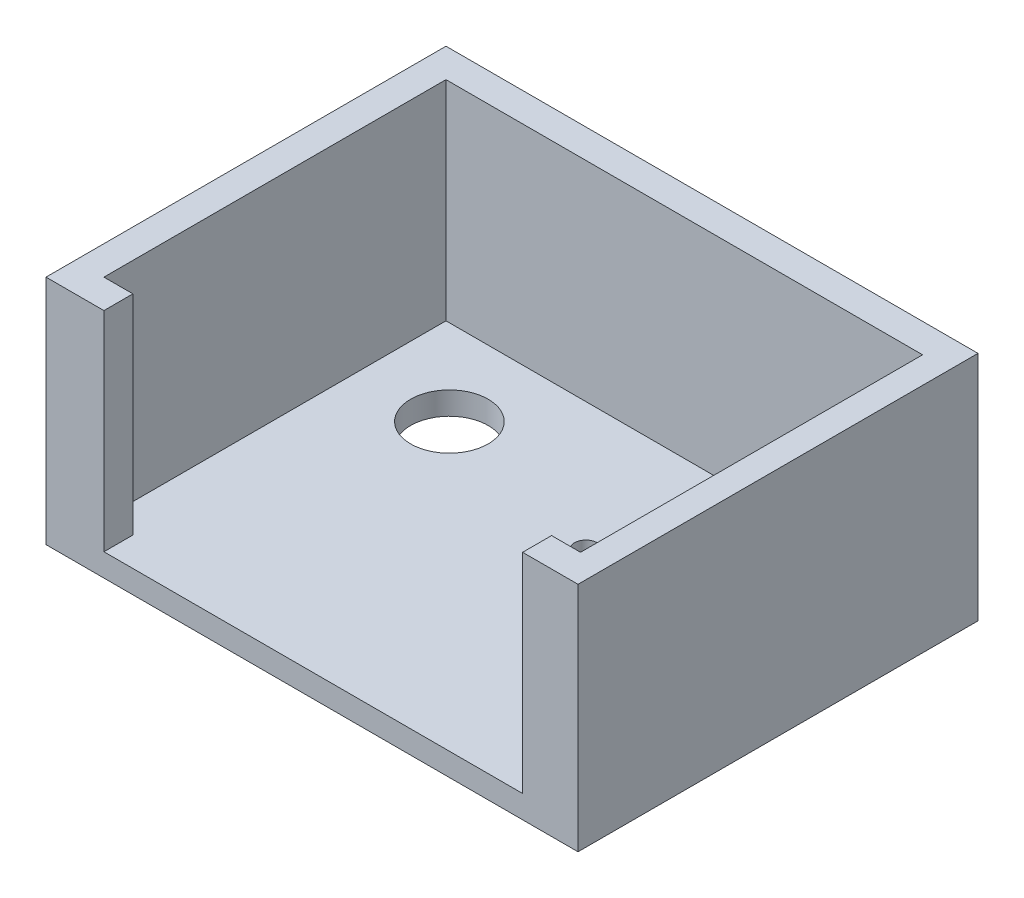
ISO-10303-21;
HEADER;
FILE_DESCRIPTION(('STEP AP214'),'2;1');
FILE_NAME('part.step','',(''),(''),'','','');
FILE_SCHEMA(('AUTOMOTIVE_DESIGN { 1 0 10303 214 1 1 1 1 }'));
ENDSEC;
DATA;
#1=APPLICATION_CONTEXT('core data for automotive mechanical design processes');
#2=APPLICATION_PROTOCOL_DEFINITION('international standard','automotive_design',2000,#1);
#3=PRODUCT_CONTEXT('',#1,'mechanical');
#4=PRODUCT('Part','Part','',(#3));
#5=PRODUCT_RELATED_PRODUCT_CATEGORY('part','',(#4));
#6=PRODUCT_DEFINITION_FORMATION('','',#4);
#7=PRODUCT_DEFINITION_CONTEXT('part definition',#1,'design');
#8=PRODUCT_DEFINITION('design','',#6,#7);
#9=PRODUCT_DEFINITION_SHAPE('','',#8);
#10=(LENGTH_UNIT() NAMED_UNIT(*) SI_UNIT(.MILLI.,.METRE.));
#11=(NAMED_UNIT(*) PLANE_ANGLE_UNIT() SI_UNIT($,.RADIAN.));
#12=(NAMED_UNIT(*) SI_UNIT($,.STERADIAN.) SOLID_ANGLE_UNIT());
#13=UNCERTAINTY_MEASURE_WITH_UNIT(LENGTH_MEASURE(1.E-05),#10,'distance_accuracy_value','');
#14=(GEOMETRIC_REPRESENTATION_CONTEXT(3) GLOBAL_UNCERTAINTY_ASSIGNED_CONTEXT((#13)) GLOBAL_UNIT_ASSIGNED_CONTEXT((#10,
#11,#12)) REPRESENTATION_CONTEXT('',''));
#15=CARTESIAN_POINT('',(0.,0.,0.));
#16=DIRECTION('',(0.,0.,1.));
#17=DIRECTION('',(1.,0.,0.));
#18=AXIS2_PLACEMENT_3D('',#15,#16,#17);
#19=CARTESIAN_POINT('',(1.27,1.,-1.27));
#20=DIRECTION('',(0.,0.,1.));
#21=DIRECTION('',(1.,0.,0.));
#22=AXIS2_PLACEMENT_3D('',#19,#20,#21);
#23=PLANE('',#22);
#24=DIRECTION('',(1.,0.,0.));
#25=VECTOR('',#24,1.);
#26=CARTESIAN_POINT('',(1.27,1.,-1.27));
#27=LINE('',#26,#25);
#28=CARTESIAN_POINT('',(20.9,1.,-1.27));
#29=VERTEX_POINT('',#28);
#30=CARTESIAN_POINT('',(22.17,1.,-1.27));
#31=VERTEX_POINT('',#30);
#32=EDGE_CURVE('E183',#29,#31,#27,.T.);
#33=ORIENTED_EDGE('',*,*,#32,.F.);
#34=DIRECTION('',(0.,-1.,0.));
#35=VECTOR('',#34,1.);
#36=CARTESIAN_POINT('',(20.9,1.,-1.27));
#37=LINE('',#36,#35);
#38=CARTESIAN_POINT('',(20.9,10.16,-1.27));
#39=VERTEX_POINT('',#38);
#40=EDGE_CURVE('E133',#39,#29,#37,.T.);
#41=ORIENTED_EDGE('',*,*,#40,.F.);
#42=DIRECTION('',(1.,0.,0.));
#43=VECTOR('',#42,1.);
#44=CARTESIAN_POINT('',(1.27,10.16,-1.27));
#45=LINE('',#44,#43);
#46=CARTESIAN_POINT('',(22.17,10.16,-1.27));
#47=VERTEX_POINT('',#46);
#48=EDGE_CURVE('E195',#39,#47,#45,.T.);
#49=ORIENTED_EDGE('',*,*,#48,.T.);
#50=DIRECTION('',(0.,1.,0.));
#51=VECTOR('',#50,1.);
#52=CARTESIAN_POINT('',(22.17,1.,-1.27));
#53=LINE('',#52,#51);
#54=EDGE_CURVE('E209',#31,#47,#53,.T.);
#55=ORIENTED_EDGE('',*,*,#54,.F.);
#56=EDGE_LOOP('',(#33,#41,#49,#55));
#57=FACE_BOUND('',#56,.T.);
#58=ADVANCED_FACE('F41',(#57),#23,.F.);
#59=CARTESIAN_POINT('',(0.,10.16,0.));
#60=DIRECTION('',(1.,0.,0.));
#61=DIRECTION('',(0.,0.,-1.));
#62=AXIS2_PLACEMENT_3D('',#59,#60,#61);
#63=PLANE('',#62);
#64=DIRECTION('',(0.,0.,1.));
#65=VECTOR('',#64,1.);
#66=CARTESIAN_POINT('',(0.,0.,0.));
#67=LINE('',#66,#65);
#68=CARTESIAN_POINT('',(0.,0.,-17.54));
#69=VERTEX_POINT('',#68);
#70=CARTESIAN_POINT('',(0.,0.,0.));
#71=VERTEX_POINT('',#70);
#72=EDGE_CURVE('E206',#69,#71,#67,.T.);
#73=ORIENTED_EDGE('',*,*,#72,.T.);
#74=DIRECTION('',(0.,-1.,0.));
#75=VECTOR('',#74,1.);
#76=CARTESIAN_POINT('',(0.,10.16,0.));
#77=LINE('',#76,#75);
#78=CARTESIAN_POINT('',(0.,10.16,0.));
#79=VERTEX_POINT('',#78);
#80=EDGE_CURVE('E11',#79,#71,#77,.T.);
#81=ORIENTED_EDGE('',*,*,#80,.F.);
#82=DIRECTION('',(0.,0.,1.));
#83=VECTOR('',#82,1.);
#84=CARTESIAN_POINT('',(0.,10.16,0.));
#85=LINE('',#84,#83);
#86=CARTESIAN_POINT('',(0.,10.16,-17.54));
#87=VERTEX_POINT('',#86);
#88=EDGE_CURVE('E213',#87,#79,#85,.T.);
#89=ORIENTED_EDGE('',*,*,#88,.F.);
#90=DIRECTION('',(0.,-1.,0.));
#91=VECTOR('',#90,1.);
#92=CARTESIAN_POINT('',(0.,10.16,-17.54));
#93=LINE('',#92,#91);
#94=EDGE_CURVE('E224',#87,#69,#93,.T.);
#95=ORIENTED_EDGE('',*,*,#94,.T.);
#96=EDGE_LOOP('',(#73,#81,#89,#95));
#97=FACE_BOUND('',#96,.T.);
#98=ADVANCED_FACE('F43',(#97),#63,.F.);
#99=CARTESIAN_POINT('',(0.,10.16,0.));
#100=DIRECTION('',(0.,0.,-1.));
#101=DIRECTION('',(-1.,0.,0.));
#102=AXIS2_PLACEMENT_3D('',#99,#100,#101);
#103=PLANE('',#102);
#104=DIRECTION('',(1.,0.,0.));
#105=VECTOR('',#104,1.);
#106=CARTESIAN_POINT('',(0.,10.16,0.));
#107=LINE('',#106,#105);
#108=CARTESIAN_POINT('',(20.9,10.16,0.));
#109=VERTEX_POINT('',#108);
#110=CARTESIAN_POINT('',(23.33,10.16,0.));
#111=VERTEX_POINT('',#110);
#112=EDGE_CURVE('E150',#109,#111,#107,.T.);
#113=ORIENTED_EDGE('',*,*,#112,.F.);
#114=DIRECTION('',(0.,-1.,0.));
#115=VECTOR('',#114,1.);
#116=CARTESIAN_POINT('',(20.9,1.,0.));
#117=LINE('',#116,#115);
#118=CARTESIAN_POINT('',(20.9,1.,0.));
#119=VERTEX_POINT('',#118);
#120=EDGE_CURVE('E130',#109,#119,#117,.T.);
#121=ORIENTED_EDGE('',*,*,#120,.T.);
#122=DIRECTION('',(-1.,0.,0.));
#123=VECTOR('',#122,1.);
#124=CARTESIAN_POINT('',(20.9,1.,0.));
#125=LINE('',#124,#123);
#126=CARTESIAN_POINT('',(2.54,1.,0.));
#127=VERTEX_POINT('',#126);
#128=EDGE_CURVE('E139',#119,#127,#125,.T.);
#129=ORIENTED_EDGE('',*,*,#128,.T.);
#130=DIRECTION('',(0.,1.,0.));
#131=VECTOR('',#130,1.);
#132=CARTESIAN_POINT('',(2.54,1.,0.));
#133=LINE('',#132,#131);
#134=CARTESIAN_POINT('',(2.54,10.16,0.));
#135=VERTEX_POINT('',#134);
#136=EDGE_CURVE('E136',#127,#135,#133,.T.);
#137=ORIENTED_EDGE('',*,*,#136,.T.);
#138=EDGE_CURVE('E217',#79,#135,#107,.T.);
#139=ORIENTED_EDGE('',*,*,#138,.F.);
#140=ORIENTED_EDGE('',*,*,#80,.T.);
#141=DIRECTION('',(1.,0.,0.));
#142=VECTOR('',#141,1.);
#143=CARTESIAN_POINT('',(0.,0.,0.));
#144=LINE('',#143,#142);
#145=CARTESIAN_POINT('',(23.33,0.,0.));
#146=VERTEX_POINT('',#145);
#147=EDGE_CURVE('E227',#71,#146,#144,.T.);
#148=ORIENTED_EDGE('',*,*,#147,.T.);
#149=DIRECTION('',(0.,-1.,0.));
#150=VECTOR('',#149,1.);
#151=CARTESIAN_POINT('',(23.33,10.16,0.));
#152=LINE('',#151,#150);
#153=EDGE_CURVE('E49',#111,#146,#152,.T.);
#154=ORIENTED_EDGE('',*,*,#153,.F.);
#155=EDGE_LOOP('',(#113,#121,#129,#137,#139,#140,#148,#154));
#156=FACE_BOUND('',#155,.T.);
#157=ADVANCED_FACE('F148',(#156),#103,.F.);
#158=CARTESIAN_POINT('',(23.33,10.16,0.));
#159=DIRECTION('',(-1.,0.,0.));
#160=DIRECTION('',(0.,0.,1.));
#161=AXIS2_PLACEMENT_3D('',#158,#159,#160);
#162=PLANE('',#161);
#163=DIRECTION('',(0.,0.,-1.));
#164=VECTOR('',#163,1.);
#165=CARTESIAN_POINT('',(23.33,0.,0.));
#166=LINE('',#165,#164);
#167=CARTESIAN_POINT('',(23.33,0.,-17.54));
#168=VERTEX_POINT('',#167);
#169=EDGE_CURVE('E229',#146,#168,#166,.T.);
#170=ORIENTED_EDGE('',*,*,#169,.T.);
#171=DIRECTION('',(0.,-1.,0.));
#172=VECTOR('',#171,1.);
#173=CARTESIAN_POINT('',(23.33,10.16,-17.54));
#174=LINE('',#173,#172);
#175=CARTESIAN_POINT('',(23.33,10.16,-17.54));
#176=VERTEX_POINT('',#175);
#177=EDGE_CURVE('E234',#176,#168,#174,.T.);
#178=ORIENTED_EDGE('',*,*,#177,.F.);
#179=DIRECTION('',(0.,0.,-1.));
#180=VECTOR('',#179,1.);
#181=CARTESIAN_POINT('',(23.33,10.16,0.));
#182=LINE('',#181,#180);
#183=EDGE_CURVE('E220',#111,#176,#182,.T.);
#184=ORIENTED_EDGE('',*,*,#183,.F.);
#185=ORIENTED_EDGE('',*,*,#153,.T.);
#186=EDGE_LOOP('',(#170,#178,#184,#185));
#187=FACE_BOUND('',#186,.T.);
#188=ADVANCED_FACE('F240',(#187),#162,.F.);
#189=CARTESIAN_POINT('',(0.,10.16,-17.54));
#190=DIRECTION('',(0.,0.,1.));
#191=DIRECTION('',(1.,0.,0.));
#192=AXIS2_PLACEMENT_3D('',#189,#190,#191);
#193=PLANE('',#192);
#194=DIRECTION('',(-1.,0.,0.));
#195=VECTOR('',#194,1.);
#196=CARTESIAN_POINT('',(0.,0.,-17.54));
#197=LINE('',#196,#195);
#198=EDGE_CURVE('E216',#168,#69,#197,.T.);
#199=ORIENTED_EDGE('',*,*,#198,.T.);
#200=ORIENTED_EDGE('',*,*,#94,.F.);
#201=DIRECTION('',(-1.,0.,0.));
#202=VECTOR('',#201,1.);
#203=CARTESIAN_POINT('',(0.,10.16,-17.54));
#204=LINE('',#203,#202);
#205=EDGE_CURVE('E222',#176,#87,#204,.T.);
#206=ORIENTED_EDGE('',*,*,#205,.F.);
#207=ORIENTED_EDGE('',*,*,#177,.T.);
#208=EDGE_LOOP('',(#199,#200,#206,#207));
#209=FACE_BOUND('',#208,.T.);
#210=ADVANCED_FACE('F248',(#209),#193,.F.);
#211=CARTESIAN_POINT('',(0.,10.16,0.));
#212=DIRECTION('',(0.,-1.,0.));
#213=DIRECTION('',(0.,0.,-1.));
#214=AXIS2_PLACEMENT_3D('',#211,#212,#213);
#215=PLANE('',#214);
#216=ORIENTED_EDGE('',*,*,#48,.F.);
#217=DIRECTION('',(0.,0.,1.));
#218=VECTOR('',#217,1.);
#219=CARTESIAN_POINT('',(20.9,10.16,0.));
#220=LINE('',#219,#218);
#221=EDGE_CURVE('E161',#39,#109,#220,.T.);
#222=ORIENTED_EDGE('',*,*,#221,.T.);
#223=ORIENTED_EDGE('',*,*,#112,.T.);
#224=ORIENTED_EDGE('',*,*,#183,.T.);
#225=ORIENTED_EDGE('',*,*,#205,.T.);
#226=ORIENTED_EDGE('',*,*,#88,.T.);
#227=ORIENTED_EDGE('',*,*,#138,.T.);
#228=DIRECTION('',(0.,0.,-1.));
#229=VECTOR('',#228,1.);
#230=CARTESIAN_POINT('',(2.54,10.16,0.));
#231=LINE('',#230,#229);
#232=CARTESIAN_POINT('',(2.54,10.16,-1.27));
#233=VERTEX_POINT('',#232);
#234=EDGE_CURVE('E157',#135,#233,#231,.T.);
#235=ORIENTED_EDGE('',*,*,#234,.T.);
#236=CARTESIAN_POINT('',(1.27,10.16,-1.27));
#237=VERTEX_POINT('',#236);
#238=EDGE_CURVE('E196',#237,#233,#45,.T.);
#239=ORIENTED_EDGE('',*,*,#238,.F.);
#240=DIRECTION('',(0.,0.,1.));
#241=VECTOR('',#240,1.);
#242=CARTESIAN_POINT('',(1.27,10.16,-1.27));
#243=LINE('',#242,#241);
#244=CARTESIAN_POINT('',(1.27,10.16,-16.27));
#245=VERTEX_POINT('',#244);
#246=EDGE_CURVE('E64',#245,#237,#243,.T.);
#247=ORIENTED_EDGE('',*,*,#246,.F.);
#248=DIRECTION('',(-1.,0.,0.));
#249=VECTOR('',#248,1.);
#250=CARTESIAN_POINT('',(1.27,10.16,-16.27));
#251=LINE('',#250,#249);
#252=CARTESIAN_POINT('',(22.17,10.16,-16.27));
#253=VERTEX_POINT('',#252);
#254=EDGE_CURVE('E184',#253,#245,#251,.T.);
#255=ORIENTED_EDGE('',*,*,#254,.F.);
#256=DIRECTION('',(0.,0.,-1.));
#257=VECTOR('',#256,1.);
#258=CARTESIAN_POINT('',(22.17,10.16,-1.27));
#259=LINE('',#258,#257);
#260=EDGE_CURVE('E199',#47,#253,#259,.T.);
#261=ORIENTED_EDGE('',*,*,#260,.F.);
#262=EDGE_LOOP('',(#216,#222,#223,#224,#225,#226,#227,#235,#239,#247,#255,#261));
#263=FACE_BOUND('',#262,.T.);
#264=ADVANCED_FACE('F255',(#263),#215,.F.);
#265=CARTESIAN_POINT('',(0.,0.,0.));
#266=DIRECTION('',(0.,-1.,0.));
#267=DIRECTION('',(0.,0.,-1.));
#268=AXIS2_PLACEMENT_3D('',#265,#266,#267);
#269=PLANE('',#268);
#270=CARTESIAN_POINT('',(5.17,0.,-12.52));
#271=DIRECTION('',(0.,1.,0.));
#272=DIRECTION('',(0.,0.,1.));
#273=AXIS2_PLACEMENT_3D('',#270,#271,#272);
#274=CIRCLE('',#273,1.7);
#275=CARTESIAN_POINT('',(5.17,0.,-10.82));
#276=VERTEX_POINT('',#275);
#277=EDGE_CURVE('E164',#276,#276,#274,.T.);
#278=ORIENTED_EDGE('',*,*,#277,.T.);
#279=EDGE_LOOP('',(#278));
#280=FACE_BOUND('',#279,.T.);
#281=CARTESIAN_POINT('',(18.27,0.,-12.52));
#282=DIRECTION('',(0.,1.,0.));
#283=DIRECTION('',(0.,0.,1.));
#284=AXIS2_PLACEMENT_3D('',#281,#282,#283);
#285=CIRCLE('',#284,1.7);
#286=CARTESIAN_POINT('',(18.27,0.,-10.82));
#287=VERTEX_POINT('',#286);
#288=EDGE_CURVE('E173',#287,#287,#285,.T.);
#289=ORIENTED_EDGE('',*,*,#288,.T.);
#290=EDGE_LOOP('',(#289));
#291=FACE_BOUND('',#290,.T.);
#292=CARTESIAN_POINT('',(13.015,0.,-10.66));
#293=DIRECTION('',(0.,1.,0.));
#294=DIRECTION('',(0.,0.,1.));
#295=AXIS2_PLACEMENT_3D('',#292,#293,#294);
#296=CIRCLE('',#295,0.500000000000001);
#297=CARTESIAN_POINT('',(13.015,0.,-10.16));
#298=VERTEX_POINT('',#297);
#299=EDGE_CURVE('E163',#298,#298,#296,.T.);
#300=ORIENTED_EDGE('',*,*,#299,.T.);
#301=EDGE_LOOP('',(#300));
#302=FACE_BOUND('',#301,.T.);
#303=ORIENTED_EDGE('',*,*,#72,.F.);
#304=ORIENTED_EDGE('',*,*,#198,.F.);
#305=ORIENTED_EDGE('',*,*,#169,.F.);
#306=ORIENTED_EDGE('',*,*,#147,.F.);
#307=EDGE_LOOP('',(#303,#304,#305,#306));
#308=FACE_BOUND('',#307,.T.);
#309=ADVANCED_FACE('F245',(#280,#291,#302,#308),#269,.T.);
#310=CARTESIAN_POINT('',(1.27,1.,-1.27));
#311=DIRECTION('',(-1.,0.,0.));
#312=DIRECTION('',(0.,0.,1.));
#313=AXIS2_PLACEMENT_3D('',#310,#311,#312);
#314=PLANE('',#313);
#315=ORIENTED_EDGE('',*,*,#246,.T.);
#316=DIRECTION('',(0.,1.,0.));
#317=VECTOR('',#316,1.);
#318=CARTESIAN_POINT('',(1.27,1.,-1.27));
#319=LINE('',#318,#317);
#320=CARTESIAN_POINT('',(1.27,1.,-1.27));
#321=VERTEX_POINT('',#320);
#322=EDGE_CURVE('E193',#321,#237,#319,.T.);
#323=ORIENTED_EDGE('',*,*,#322,.F.);
#324=DIRECTION('',(0.,0.,1.));
#325=VECTOR('',#324,1.);
#326=CARTESIAN_POINT('',(1.27,1.,-1.27));
#327=LINE('',#326,#325);
#328=CARTESIAN_POINT('',(1.27,1.,-16.27));
#329=VERTEX_POINT('',#328);
#330=EDGE_CURVE('E181',#329,#321,#327,.T.);
#331=ORIENTED_EDGE('',*,*,#330,.F.);
#332=DIRECTION('',(0.,1.,0.));
#333=VECTOR('',#332,1.);
#334=CARTESIAN_POINT('',(1.27,1.,-16.27));
#335=LINE('',#334,#333);
#336=EDGE_CURVE('E204',#329,#245,#335,.T.);
#337=ORIENTED_EDGE('',*,*,#336,.T.);
#338=EDGE_LOOP('',(#315,#323,#331,#337));
#339=FACE_BOUND('',#338,.T.);
#340=ADVANCED_FACE('F266',(#339),#314,.F.);
#341=CARTESIAN_POINT('',(1.27,1.,-16.27));
#342=DIRECTION('',(0.,0.,-1.));
#343=DIRECTION('',(-1.,0.,0.));
#344=AXIS2_PLACEMENT_3D('',#341,#342,#343);
#345=PLANE('',#344);
#346=ORIENTED_EDGE('',*,*,#254,.T.);
#347=ORIENTED_EDGE('',*,*,#336,.F.);
#348=DIRECTION('',(-1.,0.,0.));
#349=VECTOR('',#348,1.);
#350=CARTESIAN_POINT('',(1.27,1.,-16.27));
#351=LINE('',#350,#349);
#352=CARTESIAN_POINT('',(22.17,1.,-16.27));
#353=VERTEX_POINT('',#352);
#354=EDGE_CURVE('E190',#353,#329,#351,.T.);
#355=ORIENTED_EDGE('',*,*,#354,.F.);
#356=DIRECTION('',(0.,1.,0.));
#357=VECTOR('',#356,1.);
#358=CARTESIAN_POINT('',(22.17,1.,-16.27));
#359=LINE('',#358,#357);
#360=EDGE_CURVE('E207',#353,#253,#359,.T.);
#361=ORIENTED_EDGE('',*,*,#360,.T.);
#362=EDGE_LOOP('',(#346,#347,#355,#361));
#363=FACE_BOUND('',#362,.T.);
#364=ADVANCED_FACE('F263',(#363),#345,.F.);
#365=CARTESIAN_POINT('',(22.17,1.,-1.27));
#366=DIRECTION('',(1.,0.,0.));
#367=DIRECTION('',(0.,0.,-1.));
#368=AXIS2_PLACEMENT_3D('',#365,#366,#367);
#369=PLANE('',#368);
#370=ORIENTED_EDGE('',*,*,#260,.T.);
#371=ORIENTED_EDGE('',*,*,#360,.F.);
#372=DIRECTION('',(0.,0.,-1.));
#373=VECTOR('',#372,1.);
#374=CARTESIAN_POINT('',(22.17,1.,-1.27));
#375=LINE('',#374,#373);
#376=EDGE_CURVE('E187',#31,#353,#375,.T.);
#377=ORIENTED_EDGE('',*,*,#376,.F.);
#378=ORIENTED_EDGE('',*,*,#54,.T.);
#379=EDGE_LOOP('',(#370,#371,#377,#378));
#380=FACE_BOUND('',#379,.T.);
#381=ADVANCED_FACE('F274',(#380),#369,.F.);
#382=ORIENTED_EDGE('',*,*,#238,.T.);
#383=DIRECTION('',(0.,1.,0.));
#384=VECTOR('',#383,1.);
#385=CARTESIAN_POINT('',(2.54,1.,-1.27));
#386=LINE('',#385,#384);
#387=CARTESIAN_POINT('',(2.54,1.,-1.27));
#388=VERTEX_POINT('',#387);
#389=EDGE_CURVE('E151',#388,#233,#386,.T.);
#390=ORIENTED_EDGE('',*,*,#389,.F.);
#391=EDGE_CURVE('E185',#321,#388,#27,.T.);
#392=ORIENTED_EDGE('',*,*,#391,.F.);
#393=ORIENTED_EDGE('',*,*,#322,.T.);
#394=EDGE_LOOP('',(#382,#390,#392,#393));
#395=FACE_BOUND('',#394,.T.);
#396=ADVANCED_FACE('F270',(#395),#23,.F.);
#397=CARTESIAN_POINT('',(0.,1.,0.));
#398=DIRECTION('',(0.,-1.,0.));
#399=DIRECTION('',(0.,0.,-1.));
#400=AXIS2_PLACEMENT_3D('',#397,#398,#399);
#401=PLANE('',#400);
#402=CARTESIAN_POINT('',(5.17,1.,-12.52));
#403=DIRECTION('',(0.,1.,0.));
#404=DIRECTION('',(0.,0.,1.));
#405=AXIS2_PLACEMENT_3D('',#402,#403,#404);
#406=CIRCLE('',#405,1.7);
#407=CARTESIAN_POINT('',(5.17,1.,-10.82));
#408=VERTEX_POINT('',#407);
#409=EDGE_CURVE('E167',#408,#408,#406,.T.);
#410=ORIENTED_EDGE('',*,*,#409,.F.);
#411=EDGE_LOOP('',(#410));
#412=FACE_BOUND('',#411,.T.);
#413=CARTESIAN_POINT('',(18.27,1.,-12.52));
#414=DIRECTION('',(0.,1.,0.));
#415=DIRECTION('',(0.,0.,1.));
#416=AXIS2_PLACEMENT_3D('',#413,#414,#415);
#417=CIRCLE('',#416,1.7);
#418=CARTESIAN_POINT('',(18.27,1.,-10.82));
#419=VERTEX_POINT('',#418);
#420=EDGE_CURVE('E170',#419,#419,#417,.T.);
#421=ORIENTED_EDGE('',*,*,#420,.F.);
#422=EDGE_LOOP('',(#421));
#423=FACE_BOUND('',#422,.T.);
#424=CARTESIAN_POINT('',(13.015,1.,-10.66));
#425=DIRECTION('',(0.,1.,0.));
#426=DIRECTION('',(0.,0.,1.));
#427=AXIS2_PLACEMENT_3D('',#424,#425,#426);
#428=CIRCLE('',#427,0.500000000000001);
#429=CARTESIAN_POINT('',(13.015,1.,-10.16));
#430=VERTEX_POINT('',#429);
#431=EDGE_CURVE('E176',#430,#430,#428,.T.);
#432=ORIENTED_EDGE('',*,*,#431,.F.);
#433=EDGE_LOOP('',(#432));
#434=FACE_BOUND('',#433,.T.);
#435=ORIENTED_EDGE('',*,*,#330,.T.);
#436=ORIENTED_EDGE('',*,*,#391,.T.);
#437=DIRECTION('',(0.,0.,-1.));
#438=VECTOR('',#437,1.);
#439=CARTESIAN_POINT('',(2.54,1.,0.));
#440=LINE('',#439,#438);
#441=EDGE_CURVE('E135',#127,#388,#440,.T.);
#442=ORIENTED_EDGE('',*,*,#441,.F.);
#443=ORIENTED_EDGE('',*,*,#128,.F.);
#444=DIRECTION('',(0.,0.,-1.));
#445=VECTOR('',#444,1.);
#446=CARTESIAN_POINT('',(20.9,1.,0.));
#447=LINE('',#446,#445);
#448=EDGE_CURVE('E56',#119,#29,#447,.T.);
#449=ORIENTED_EDGE('',*,*,#448,.T.);
#450=ORIENTED_EDGE('',*,*,#32,.T.);
#451=ORIENTED_EDGE('',*,*,#376,.T.);
#452=ORIENTED_EDGE('',*,*,#354,.T.);
#453=EDGE_LOOP('',(#435,#436,#442,#443,#449,#450,#451,#452));
#454=FACE_BOUND('',#453,.T.);
#455=ADVANCED_FACE('F141',(#412,#423,#434,#454),#401,.F.);
#456=CARTESIAN_POINT('',(13.015,0.,-10.66));
#457=DIRECTION('',(0.,1.,0.));
#458=DIRECTION('',(0.,0.,1.));
#459=AXIS2_PLACEMENT_3D('',#456,#457,#458);
#460=CYLINDRICAL_SURFACE('',#459,0.500000000000001);
#461=ORIENTED_EDGE('',*,*,#299,.F.);
#462=EDGE_LOOP('',(#461));
#463=FACE_BOUND('',#462,.T.);
#464=ORIENTED_EDGE('',*,*,#431,.T.);
#465=EDGE_LOOP('',(#464));
#466=FACE_BOUND('',#465,.T.);
#467=ADVANCED_FACE('F324',(#463,#466),#460,.F.);
#468=CARTESIAN_POINT('',(18.27,0.,-12.52));
#469=DIRECTION('',(0.,1.,0.));
#470=DIRECTION('',(0.,0.,1.));
#471=AXIS2_PLACEMENT_3D('',#468,#469,#470);
#472=CYLINDRICAL_SURFACE('',#471,1.7);
#473=ORIENTED_EDGE('',*,*,#288,.F.);
#474=EDGE_LOOP('',(#473));
#475=FACE_BOUND('',#474,.T.);
#476=ORIENTED_EDGE('',*,*,#420,.T.);
#477=EDGE_LOOP('',(#476));
#478=FACE_BOUND('',#477,.T.);
#479=ADVANCED_FACE('F353',(#475,#478),#472,.F.);
#480=CARTESIAN_POINT('',(5.17,0.,-12.52));
#481=DIRECTION('',(0.,1.,0.));
#482=DIRECTION('',(0.,0.,1.));
#483=AXIS2_PLACEMENT_3D('',#480,#481,#482);
#484=CYLINDRICAL_SURFACE('',#483,1.7);
#485=ORIENTED_EDGE('',*,*,#277,.F.);
#486=EDGE_LOOP('',(#485));
#487=FACE_BOUND('',#486,.T.);
#488=ORIENTED_EDGE('',*,*,#409,.T.);
#489=EDGE_LOOP('',(#488));
#490=FACE_BOUND('',#489,.T.);
#491=ADVANCED_FACE('F333',(#487,#490),#484,.F.);
#492=CARTESIAN_POINT('',(20.9,1.,0.));
#493=DIRECTION('',(1.,0.,0.));
#494=DIRECTION('',(0.,0.,-1.));
#495=AXIS2_PLACEMENT_3D('',#492,#493,#494);
#496=PLANE('',#495);
#497=ORIENTED_EDGE('',*,*,#40,.T.);
#498=ORIENTED_EDGE('',*,*,#448,.F.);
#499=ORIENTED_EDGE('',*,*,#120,.F.);
#500=ORIENTED_EDGE('',*,*,#221,.F.);
#501=EDGE_LOOP('',(#497,#498,#499,#500));
#502=FACE_BOUND('',#501,.T.);
#503=ADVANCED_FACE('F128',(#502),#496,.F.);
#504=CARTESIAN_POINT('',(2.54,1.,0.));
#505=DIRECTION('',(-1.,0.,0.));
#506=DIRECTION('',(0.,0.,1.));
#507=AXIS2_PLACEMENT_3D('',#504,#505,#506);
#508=PLANE('',#507);
#509=ORIENTED_EDGE('',*,*,#136,.F.);
#510=ORIENTED_EDGE('',*,*,#441,.T.);
#511=ORIENTED_EDGE('',*,*,#389,.T.);
#512=ORIENTED_EDGE('',*,*,#234,.F.);
#513=EDGE_LOOP('',(#509,#510,#511,#512));
#514=FACE_BOUND('',#513,.T.);
#515=ADVANCED_FACE('F273',(#514),#508,.F.);
#516=CLOSED_SHELL('',(#58,#98,#157,#188,#210,#264,#309,#340,#364,#381,#396,#455,#467,#479,#491,
#503,#515));
#517=MANIFOLD_SOLID_BREP('B2',#516);
#518=ADVANCED_BREP_SHAPE_REPRESENTATION('',(#18,#517),#14);
#519=SHAPE_DEFINITION_REPRESENTATION(#9,#518);
ENDSEC;
END-ISO-10303-21;
